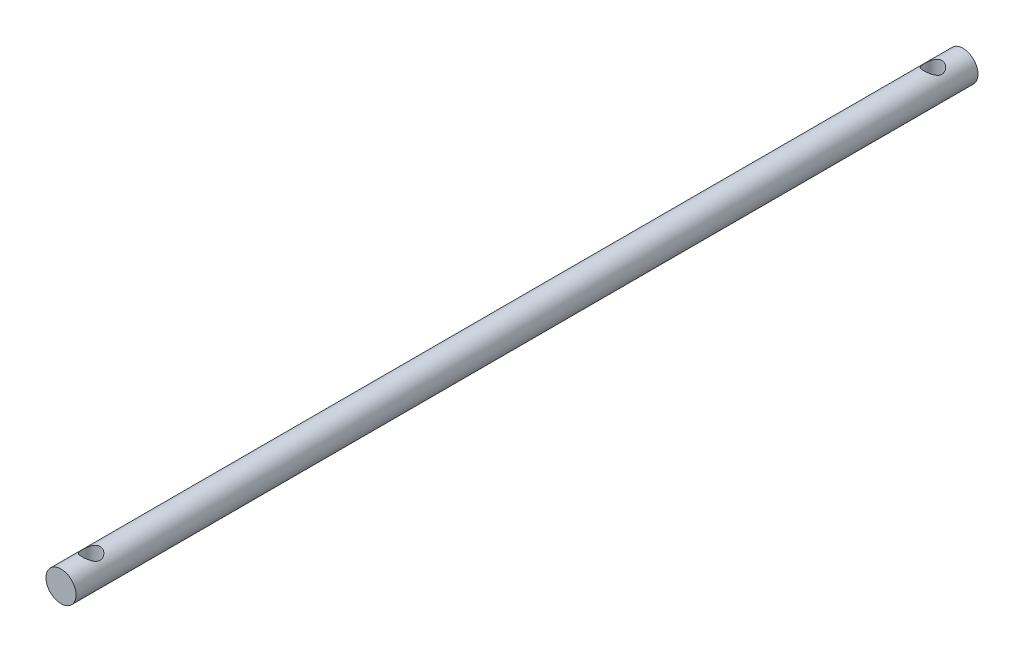
ISO-10303-21;
HEADER;
FILE_DESCRIPTION(('STEP AP214'),'2;1');
FILE_NAME('part.step','',(''),(''),'','','');
FILE_SCHEMA(('AUTOMOTIVE_DESIGN { 1 0 10303 214 1 1 1 1 }'));
ENDSEC;
DATA;
#1=APPLICATION_CONTEXT('core data for automotive mechanical design processes');
#2=APPLICATION_PROTOCOL_DEFINITION('international standard','automotive_design',2000,#1);
#3=PRODUCT_CONTEXT('',#1,'mechanical');
#4=PRODUCT('Part','Part','',(#3));
#5=PRODUCT_RELATED_PRODUCT_CATEGORY('part','',(#4));
#6=PRODUCT_DEFINITION_FORMATION('','',#4);
#7=PRODUCT_DEFINITION_CONTEXT('part definition',#1,'design');
#8=PRODUCT_DEFINITION('design','',#6,#7);
#9=PRODUCT_DEFINITION_SHAPE('','',#8);
#10=(LENGTH_UNIT() NAMED_UNIT(*) SI_UNIT(.MILLI.,.METRE.));
#11=(NAMED_UNIT(*) PLANE_ANGLE_UNIT() SI_UNIT($,.RADIAN.));
#12=(NAMED_UNIT(*) SI_UNIT($,.STERADIAN.) SOLID_ANGLE_UNIT());
#13=UNCERTAINTY_MEASURE_WITH_UNIT(LENGTH_MEASURE(1.E-05),#10,'distance_accuracy_value','');
#14=(GEOMETRIC_REPRESENTATION_CONTEXT(3) GLOBAL_UNCERTAINTY_ASSIGNED_CONTEXT((#13)) GLOBAL_UNIT_ASSIGNED_CONTEXT((#10,
#11,#12)) REPRESENTATION_CONTEXT('',''));
#15=CARTESIAN_POINT('',(0.,0.,0.));
#16=DIRECTION('',(0.,0.,1.));
#17=DIRECTION('',(1.,0.,0.));
#18=AXIS2_PLACEMENT_3D('',#15,#16,#17);
#19=CARTESIAN_POINT('',(0.,0.,150.));
#20=DIRECTION('',(0.,0.,-1.));
#21=DIRECTION('',(-1.,0.,0.));
#22=AXIS2_PLACEMENT_3D('',#19,#20,#21);
#23=CYLINDRICAL_SURFACE('',#22,2.5);
#24=CARTESIAN_POINT('',(0.,-2.5,146.5));
#25=CARTESIAN_POINT('',(0.0767298334620159,-2.49999625789732,146.49999590899));
#26=CARTESIAN_POINT('',(0.153582320644176,-2.4964290461501,146.494071329074));
#27=CARTESIAN_POINT('',(0.304975509530677,-2.48249903608568,146.470675680485));
#28=CARTESIAN_POINT('',(0.379510034596047,-2.47211948032719,146.453176138146));
#29=CARTESIAN_POINT('',(0.523751827790834,-2.44561558054488,146.407613638833));
#30=CARTESIAN_POINT('',(0.593481028226559,-2.42951973272944,146.379603041837));
#31=CARTESIAN_POINT('',(0.727030318214653,-2.39295367626408,146.314139666859));
#32=CARTESIAN_POINT('',(0.790851869416382,-2.37248455380255,146.276689233031));
#33=CARTESIAN_POINT('',(0.916299278999314,-2.32705360719088,146.190225173291));
#34=CARTESIAN_POINT('',(0.977384020081408,-2.30186792195985,146.140546304649));
#35=CARTESIAN_POINT('',(1.0908827041189,-2.25030439279634,146.032532796172));
#36=CARTESIAN_POINT('',(1.14328534948112,-2.22392505153571,145.974187062813));
#37=CARTESIAN_POINT('',(1.24444996762974,-2.1691106699591,145.842076489503));
#38=CARTESIAN_POINT('',(1.29197766378809,-2.14082017703649,145.767298229019));
#39=CARTESIAN_POINT('',(1.37361437764896,-2.08938301412124,145.609153426757));
#40=CARTESIAN_POINT('',(1.4077451733516,-2.06622802273938,145.525801103752));
#41=CARTESIAN_POINT('',(1.45440601714222,-2.0335462966093,145.373403549347));
#42=CARTESIAN_POINT('',(1.47016197246827,-2.02207883137591,145.30576400139));
#43=CARTESIAN_POINT('',(1.49216172340475,-2.00590308295502,145.16819628417));
#44=CARTESIAN_POINT('',(1.49841734556836,-2.00118639643759,145.098271071245));
#45=CARTESIAN_POINT('',(1.50105508796009,-1.99920922463856,144.957988505783));
#46=CARTESIAN_POINT('',(1.49741783408418,-2.00196337012718,144.887630574907));
#47=CARTESIAN_POINT('',(1.48046060478827,-2.01453261443742,144.748721224572));
#48=CARTESIAN_POINT('',(1.46713334620102,-2.02435302432227,144.680171204153));
#49=CARTESIAN_POINT('',(1.43173921881791,-2.04953186944259,144.547469757872));
#50=CARTESIAN_POINT('',(1.40978748666085,-2.06481711652538,144.483272946075));
#51=CARTESIAN_POINT('',(1.35795061770834,-2.0992705135083,144.359305009072));
#52=CARTESIAN_POINT('',(1.32806257259702,-2.11844008623467,144.299535516576));
#53=CARTESIAN_POINT('',(1.25517983184579,-2.16255327268987,144.175015902877));
#54=CARTESIAN_POINT('',(1.21080724397719,-2.18792043372994,144.111221907045));
#55=CARTESIAN_POINT('',(1.11291092783999,-2.23930599764383,143.991323516333));
#56=CARTESIAN_POINT('',(1.05937845100575,-2.26532500262151,143.935226566023));
#57=CARTESIAN_POINT('',(0.935811834382925,-2.31935504958318,143.824387018178));
#58=CARTESIAN_POINT('',(0.864517682704907,-2.34713836268534,143.770922693984));
#59=CARTESIAN_POINT('',(0.712276050458934,-2.39772428433983,143.676877952802));
#60=CARTESIAN_POINT('',(0.63133376394349,-2.42052955425517,143.63629064621));
#61=CARTESIAN_POINT('',(0.467197585268126,-2.45730392066153,143.572067817204));
#62=CARTESIAN_POINT('',(0.384467624173502,-2.47173957439705,143.547524644284));
#63=CARTESIAN_POINT('',(0.215047895144566,-2.49218842813551,143.512988802595));
#64=CARTESIAN_POINT('',(0.128363005661248,-2.49821172952738,143.502978682246));
#65=CARTESIAN_POINT('',(-0.0337146143774628,-2.5009057037461,143.498492152322));
#66=CARTESIAN_POINT('',(-0.109042473418783,-2.49873521714285,143.502091144915));
#67=CARTESIAN_POINT('',(-0.257829401986121,-2.48778712087048,143.520425853072));
#68=CARTESIAN_POINT('',(-0.331288509376163,-2.47900964518037,143.535161342806));
#69=CARTESIAN_POINT('',(-0.472574932157667,-2.4559479244219,143.574543432813));
#70=CARTESIAN_POINT('',(-0.540495750928538,-2.44180275662554,143.598940349074));
#71=CARTESIAN_POINT('',(-0.671265749087314,-2.40913880862843,143.656677376365));
#72=CARTESIAN_POINT('',(-0.734113924963957,-2.3906191658651,143.690019251347));
#73=CARTESIAN_POINT('',(-0.86000626282391,-2.34845496237359,143.768556979209));
#74=CARTESIAN_POINT('',(-0.922394150456884,-2.32447802739878,143.814623829078));
#75=CARTESIAN_POINT('',(-1.03902603131018,-2.2747426557473,143.915391393489));
#76=CARTESIAN_POINT('',(-1.09326040273742,-2.24898216586359,143.970102154853));
#77=CARTESIAN_POINT('',(-1.19931996735583,-2.19445423909889,144.094910390037));
#78=CARTESIAN_POINT('',(-1.24991019630918,-2.16573241746289,144.166083885466));
#79=CARTESIAN_POINT('',(-1.33845238915671,-2.11216182066708,144.317216024568));
#80=CARTESIAN_POINT('',(-1.37641766769784,-2.08730897997688,144.397165293893));
#81=CARTESIAN_POINT('',(-1.43142578795779,-2.04984909240518,144.546243022307));
#82=CARTESIAN_POINT('',(-1.45121625336192,-2.03575659328727,144.613980312359));
#83=CARTESIAN_POINT('',(-1.48113663905973,-2.01409605743543,144.75253207808));
#84=CARTESIAN_POINT('',(-1.49127995297632,-2.0065189764272,144.823342144328));
#85=CARTESIAN_POINT('',(-1.50134130416631,-1.99900446616267,144.966376947597));
#86=CARTESIAN_POINT('',(-1.50122089107869,-1.99909576445937,145.038605990687));
#87=CARTESIAN_POINT('',(-1.49066472959327,-2.00697717892851,145.18189443561));
#88=CARTESIAN_POINT('',(-1.48022337215758,-2.01477148138821,145.252953180081));
#89=CARTESIAN_POINT('',(-1.45040174148911,-2.03633185242981,145.388488417572));
#90=CARTESIAN_POINT('',(-1.43147636845349,-2.04979211805582,145.453117094307));
#91=CARTESIAN_POINT('',(-1.3856324207699,-2.08105501960154,145.578337254474));
#92=CARTESIAN_POINT('',(-1.35871083588476,-2.09885929040484,145.638927206961));
#93=CARTESIAN_POINT('',(-1.29289245555729,-2.14012990550919,145.764319857221));
#94=CARTESIAN_POINT('',(-1.25279167675749,-2.16404587582642,145.828341103854));
#95=CARTESIAN_POINT('',(-1.16375698389079,-2.21320127030771,145.949380072617));
#96=CARTESIAN_POINT('',(-1.11481579607793,-2.23844177205024,146.006391962153));
#97=CARTESIAN_POINT('',(-1.00009777425728,-2.29225690291479,146.121350949132));
#98=CARTESIAN_POINT('',(-0.932876819313839,-2.3207030866366,146.177931074896));
#99=CARTESIAN_POINT('',(-0.788462434445521,-2.3736542887237,146.279097855863));
#100=CARTESIAN_POINT('',(-0.711265444501472,-2.39815789310938,146.323680211985));
#101=CARTESIAN_POINT('',(-0.551125230801383,-2.43985578654396,146.397785807574));
#102=CARTESIAN_POINT('',(-0.468430086957142,-2.45725077479788,146.427728064927));
#103=CARTESIAN_POINT('',(-0.297973306118727,-2.48366273001247,146.472724695211));
#104=CARTESIAN_POINT('',(-0.210232099648524,-2.49271125871486,146.487835167857));
#105=CARTESIAN_POINT('',(-0.101558096917456,-2.49802001168187,146.496697454709));
#106=CARTESIAN_POINT('',(-0.0812762590282132,-2.49876114656362,146.497934417306));
#107=CARTESIAN_POINT('',(-0.0406658206870801,-2.49975164517367,146.499586246371));
#108=CARTESIAN_POINT('',(-0.0203372186375532,-2.50000099184316,146.500001084321));
#109=CARTESIAN_POINT('',(0.,-2.5,146.5));
#110=B_SPLINE_CURVE_WITH_KNOTS('',3,(#24,#25,#26,#27,#28,#29,#30,#31,#32,#33,#34,#35,#36,#37,
#38,#39,#40,#41,#42,#43,#44,#45,#46,#47,#48,#49,#50,#51,#52,#53,#54,#55,#56,#57,#58,#59,#60,#61,
#62,#63,#64,#65,#66,#67,#68,#69,#70,#71,#72,#73,#74,#75,#76,#77,#78,#79,#80,#81,#82,#83,#84,#85,
#86,#87,#88,#89,#90,#91,#92,#93,#94,#95,#96,#97,#98,#99,#100,#101,#102,#103,#104,#105,#106,#107,
#108,#109),.UNSPECIFIED.,.T.,.F.,(4,2,2,2,2,2,2,2,2,2,2,2,2,2,2,2,2,2,2,2,2,2,2,2,2,2,2,2,2,2,2,
2,2,2,2,2,2,2,2,2,2,2,4),(0.,0.230102237548649,0.460772627520007,0.690308884600004,
0.919788197992267,1.16681590732472,1.41416257934799,1.69183813189807,1.96906040692093,
2.17933829855636,2.38935420916583,2.59978170870732,2.81036753273875,3.01823267593212,
3.22617409809876,3.47046995225169,3.71500044803681,3.99360957884698,4.27206939275333,
4.53296790696568,4.79355286918243,5.01875602722433,5.24395461863461,5.46367785689779,
5.68344445659031,5.92601365818369,6.16886690081842,6.44336762428016,6.71757792616464,
6.932577873147,7.14727888733327,7.36278425777438,7.57840681155732,7.78364098331153,
7.9889525152304,8.22578610052296,8.46281544370218,8.73854311775526,9.01436946031993,
9.28175654462684,9.54812832184458,9.60911473335182,9.67010326027641),.UNSPECIFIED.);
#111=CARTESIAN_POINT('',(0.,-2.5,146.5));
#112=VERTEX_POINT('',#111);
#113=EDGE_CURVE('E35',#112,#112,#110,.T.);
#114=ORIENTED_EDGE('',*,*,#113,.T.);
#115=EDGE_LOOP('',(#114));
#116=FACE_BOUND('',#115,.T.);
#117=CARTESIAN_POINT('',(0.,2.5,146.5));
#118=CARTESIAN_POINT('',(-0.0767298334620159,2.49999625789732,146.49999590899));
#119=CARTESIAN_POINT('',(-0.153582320644176,2.4964290461501,146.494071329074));
#120=CARTESIAN_POINT('',(-0.304975509530677,2.48249903608568,146.470675680485));
#121=CARTESIAN_POINT('',(-0.379510034596047,2.47211948032719,146.453176138146));
#122=CARTESIAN_POINT('',(-0.523751827790834,2.44561558054488,146.407613638833));
#123=CARTESIAN_POINT('',(-0.593481028226559,2.42951973272944,146.379603041837));
#124=CARTESIAN_POINT('',(-0.727030318214653,2.39295367626408,146.314139666859));
#125=CARTESIAN_POINT('',(-0.790851869416382,2.37248455380255,146.276689233031));
#126=CARTESIAN_POINT('',(-0.916299278999314,2.32705360719088,146.190225173291));
#127=CARTESIAN_POINT('',(-0.977384020081408,2.30186792195985,146.140546304649));
#128=CARTESIAN_POINT('',(-1.0908827041189,2.25030439279634,146.032532796172));
#129=CARTESIAN_POINT('',(-1.14328534948112,2.22392505153571,145.974187062813));
#130=CARTESIAN_POINT('',(-1.24444996762974,2.1691106699591,145.842076489503));
#131=CARTESIAN_POINT('',(-1.29197766378809,2.14082017703649,145.767298229019));
#132=CARTESIAN_POINT('',(-1.37361437764896,2.08938301412124,145.609153426757));
#133=CARTESIAN_POINT('',(-1.4077451733516,2.06622802273938,145.525801103752));
#134=CARTESIAN_POINT('',(-1.45440601714222,2.0335462966093,145.373403549347));
#135=CARTESIAN_POINT('',(-1.47016197246827,2.02207883137591,145.30576400139));
#136=CARTESIAN_POINT('',(-1.49216172340475,2.00590308295502,145.16819628417));
#137=CARTESIAN_POINT('',(-1.49841734556836,2.00118639643759,145.098271071245));
#138=CARTESIAN_POINT('',(-1.50105508796009,1.99920922463856,144.957988505783));
#139=CARTESIAN_POINT('',(-1.49741783408418,2.00196337012718,144.887630574907));
#140=CARTESIAN_POINT('',(-1.48046060478827,2.01453261443742,144.748721224572));
#141=CARTESIAN_POINT('',(-1.46713334620102,2.02435302432227,144.680171204153));
#142=CARTESIAN_POINT('',(-1.43173921881791,2.04953186944259,144.547469757872));
#143=CARTESIAN_POINT('',(-1.40978748666085,2.06481711652538,144.483272946075));
#144=CARTESIAN_POINT('',(-1.35795061770834,2.0992705135083,144.359305009072));
#145=CARTESIAN_POINT('',(-1.32806257259702,2.11844008623467,144.299535516576));
#146=CARTESIAN_POINT('',(-1.25517983184579,2.16255327268987,144.175015902877));
#147=CARTESIAN_POINT('',(-1.21080724397719,2.18792043372994,144.111221907045));
#148=CARTESIAN_POINT('',(-1.11291092783999,2.23930599764383,143.991323516333));
#149=CARTESIAN_POINT('',(-1.05937845100575,2.26532500262151,143.935226566023));
#150=CARTESIAN_POINT('',(-0.935811834382925,2.31935504958318,143.824387018178));
#151=CARTESIAN_POINT('',(-0.864517682704907,2.34713836268534,143.770922693984));
#152=CARTESIAN_POINT('',(-0.712276050458934,2.39772428433983,143.676877952802));
#153=CARTESIAN_POINT('',(-0.63133376394349,2.42052955425517,143.63629064621));
#154=CARTESIAN_POINT('',(-0.467197585268126,2.45730392066153,143.572067817204));
#155=CARTESIAN_POINT('',(-0.384467624173502,2.47173957439705,143.547524644284));
#156=CARTESIAN_POINT('',(-0.215047895144566,2.49218842813551,143.512988802595));
#157=CARTESIAN_POINT('',(-0.128363005661248,2.49821172952738,143.502978682246));
#158=CARTESIAN_POINT('',(0.0337146143774628,2.5009057037461,143.498492152322));
#159=CARTESIAN_POINT('',(0.109042473418783,2.49873521714285,143.502091144915));
#160=CARTESIAN_POINT('',(0.257829401986121,2.48778712087048,143.520425853072));
#161=CARTESIAN_POINT('',(0.331288509376163,2.47900964518037,143.535161342806));
#162=CARTESIAN_POINT('',(0.472574932157667,2.4559479244219,143.574543432813));
#163=CARTESIAN_POINT('',(0.540495750928538,2.44180275662554,143.598940349074));
#164=CARTESIAN_POINT('',(0.671265749087314,2.40913880862843,143.656677376365));
#165=CARTESIAN_POINT('',(0.734113924963957,2.3906191658651,143.690019251347));
#166=CARTESIAN_POINT('',(0.86000626282391,2.34845496237359,143.768556979209));
#167=CARTESIAN_POINT('',(0.922394150456884,2.32447802739878,143.814623829078));
#168=CARTESIAN_POINT('',(1.03902603131018,2.2747426557473,143.915391393489));
#169=CARTESIAN_POINT('',(1.09326040273742,2.24898216586359,143.970102154853));
#170=CARTESIAN_POINT('',(1.19931996735583,2.19445423909889,144.094910390037));
#171=CARTESIAN_POINT('',(1.24991019630918,2.16573241746289,144.166083885466));
#172=CARTESIAN_POINT('',(1.33845238915671,2.11216182066708,144.317216024568));
#173=CARTESIAN_POINT('',(1.37641766769784,2.08730897997688,144.397165293893));
#174=CARTESIAN_POINT('',(1.43142578795779,2.04984909240518,144.546243022307));
#175=CARTESIAN_POINT('',(1.45121625336192,2.03575659328727,144.613980312359));
#176=CARTESIAN_POINT('',(1.48113663905973,2.01409605743543,144.75253207808));
#177=CARTESIAN_POINT('',(1.49127995297632,2.0065189764272,144.823342144328));
#178=CARTESIAN_POINT('',(1.50134130416631,1.99900446616267,144.966376947597));
#179=CARTESIAN_POINT('',(1.50122089107869,1.99909576445937,145.038605990687));
#180=CARTESIAN_POINT('',(1.49066472959327,2.00697717892851,145.18189443561));
#181=CARTESIAN_POINT('',(1.48022337215758,2.01477148138821,145.252953180081));
#182=CARTESIAN_POINT('',(1.45040174148911,2.03633185242981,145.388488417572));
#183=CARTESIAN_POINT('',(1.43147636845349,2.04979211805582,145.453117094307));
#184=CARTESIAN_POINT('',(1.3856324207699,2.08105501960154,145.578337254474));
#185=CARTESIAN_POINT('',(1.35871083588476,2.09885929040484,145.638927206961));
#186=CARTESIAN_POINT('',(1.29289245555729,2.14012990550919,145.764319857221));
#187=CARTESIAN_POINT('',(1.25279167675749,2.16404587582642,145.828341103854));
#188=CARTESIAN_POINT('',(1.16375698389079,2.21320127030771,145.949380072617));
#189=CARTESIAN_POINT('',(1.11481579607793,2.23844177205024,146.006391962153));
#190=CARTESIAN_POINT('',(1.00009777425728,2.29225690291479,146.121350949132));
#191=CARTESIAN_POINT('',(0.932876819313839,2.3207030866366,146.177931074896));
#192=CARTESIAN_POINT('',(0.788462434445521,2.3736542887237,146.279097855863));
#193=CARTESIAN_POINT('',(0.711265444501472,2.39815789310938,146.323680211985));
#194=CARTESIAN_POINT('',(0.551125230801383,2.43985578654396,146.397785807574));
#195=CARTESIAN_POINT('',(0.468430086957142,2.45725077479788,146.427728064927));
#196=CARTESIAN_POINT('',(0.297973306118727,2.48366273001247,146.472724695211));
#197=CARTESIAN_POINT('',(0.210232099648524,2.49271125871486,146.487835167857));
#198=CARTESIAN_POINT('',(0.101558096917456,2.49802001168187,146.496697454709));
#199=CARTESIAN_POINT('',(0.0812762590282132,2.49876114656362,146.497934417306));
#200=CARTESIAN_POINT('',(0.0406658206870801,2.49975164517367,146.499586246371));
#201=CARTESIAN_POINT('',(0.0203372186375532,2.50000099184316,146.500001084321));
#202=CARTESIAN_POINT('',(0.,2.5,146.5));
#203=B_SPLINE_CURVE_WITH_KNOTS('',3,(#117,#118,#119,#120,#121,#122,#123,#124,#125,#126,#127,
#128,#129,#130,#131,#132,#133,#134,#135,#136,#137,#138,#139,#140,#141,#142,#143,#144,#145,#146,
#147,#148,#149,#150,#151,#152,#153,#154,#155,#156,#157,#158,#159,#160,#161,#162,#163,#164,#165,
#166,#167,#168,#169,#170,#171,#172,#173,#174,#175,#176,#177,#178,#179,#180,#181,#182,#183,#184,
#185,#186,#187,#188,#189,#190,#191,#192,#193,#194,#195,#196,#197,#198,#199,#200,#201,#202),
.UNSPECIFIED.,.T.,.F.,(4,2,2,2,2,2,2,2,2,2,2,2,2,2,2,2,2,2,2,2,2,2,2,2,2,2,2,2,2,2,2,2,2,2,2,2,
2,2,2,2,2,2,4),(0.,0.230102237548649,0.460772627520007,0.690308884600004,0.919788197992267,
1.16681590732472,1.41416257934799,1.69183813189807,1.96906040692093,2.17933829855636,
2.38935420916583,2.59978170870732,2.81036753273875,3.01823267593212,3.22617409809876,
3.47046995225169,3.71500044803681,3.99360957884698,4.27206939275333,4.53296790696568,
4.79355286918243,5.01875602722433,5.24395461863461,5.46367785689779,5.68344445659031,
5.92601365818369,6.16886690081842,6.44336762428016,6.71757792616464,6.932577873147,
7.14727888733327,7.36278425777438,7.57840681155732,7.78364098331153,7.9889525152304,
8.22578610052296,8.46281544370218,8.73854311775526,9.01436946031993,9.28175654462684,
9.54812832184458,9.60911473335182,9.67010326027641),.UNSPECIFIED.);
#204=CARTESIAN_POINT('',(0.,2.5,146.5));
#205=VERTEX_POINT('',#204);
#206=EDGE_CURVE('E84',#205,#205,#203,.T.);
#207=ORIENTED_EDGE('',*,*,#206,.T.);
#208=EDGE_LOOP('',(#207));
#209=FACE_BOUND('',#208,.T.);
#210=CARTESIAN_POINT('',(0.,-2.5,6.5));
#211=CARTESIAN_POINT('',(0.0767298334620158,-2.49999625789732,6.49999590899012));
#212=CARTESIAN_POINT('',(0.153582320644178,-2.4964290461501,6.49407132907374));
#213=CARTESIAN_POINT('',(0.304975509530679,-2.48249903608568,6.47067568048467));
#214=CARTESIAN_POINT('',(0.379510034596047,-2.47211948032719,6.45317613814578));
#215=CARTESIAN_POINT('',(0.523751827790837,-2.44561558054488,6.40761363883314));
#216=CARTESIAN_POINT('',(0.593481028226566,-2.42951973272944,6.37960304183684));
#217=CARTESIAN_POINT('',(0.727030318214659,-2.39295367626407,6.31413966685897));
#218=CARTESIAN_POINT('',(0.790851869416383,-2.37248455380255,6.27668923303125));
#219=CARTESIAN_POINT('',(0.916299278999315,-2.32705360719088,6.19022517329142));
#220=CARTESIAN_POINT('',(0.977384020081415,-2.30186792195985,6.14054630464861));
#221=CARTESIAN_POINT('',(1.09088270411891,-2.25030439279634,6.03253279617173));
#222=CARTESIAN_POINT('',(1.14328534948112,-2.22392505153571,5.97418706281268));
#223=CARTESIAN_POINT('',(1.24444996762974,-2.1691106699591,5.84207648950327));
#224=CARTESIAN_POINT('',(1.29197766378809,-2.14082017703649,5.76729822901871));
#225=CARTESIAN_POINT('',(1.37361437764896,-2.08938301412124,5.60915342675689));
#226=CARTESIAN_POINT('',(1.4077451733516,-2.06622802273938,5.52580110375243));
#227=CARTESIAN_POINT('',(1.45440601714222,-2.0335462966093,5.37340354934676));
#228=CARTESIAN_POINT('',(1.47016197246826,-2.02207883137591,5.30576400138968));
#229=CARTESIAN_POINT('',(1.49216172340475,-2.00590308295503,5.16819628416964));
#230=CARTESIAN_POINT('',(1.49841734556836,-2.00118639643759,5.09827107124551));
#231=CARTESIAN_POINT('',(1.50105508796009,-1.99920922463856,4.95798850578266));
#232=CARTESIAN_POINT('',(1.49741783408419,-2.00196337012718,4.8876305749068));
#233=CARTESIAN_POINT('',(1.48046060478828,-2.01453261443741,4.74872122457241));
#234=CARTESIAN_POINT('',(1.46713334620103,-2.02435302432226,4.68017120415255));
#235=CARTESIAN_POINT('',(1.43173921881792,-2.04953186944258,4.54746975787189));
#236=CARTESIAN_POINT('',(1.40978748666087,-2.06481711652537,4.48327294607552));
#237=CARTESIAN_POINT('',(1.35795061770837,-2.09927051350828,4.35930500907188));
#238=CARTESIAN_POINT('',(1.32806257259705,-2.11844008623465,4.29953551657607));
#239=CARTESIAN_POINT('',(1.25517983184583,-2.16255327268985,4.1750159028772));
#240=CARTESIAN_POINT('',(1.21080724397723,-2.18792043372992,4.11122190704507));
#241=CARTESIAN_POINT('',(1.11291092784003,-2.23930599764381,3.99132351633298));
#242=CARTESIAN_POINT('',(1.05937845100579,-2.26532500262149,3.93522656602349));
#243=CARTESIAN_POINT('',(0.935811834382965,-2.31935504958317,3.82438701817824));
#244=CARTESIAN_POINT('',(0.864517682704956,-2.34713836268532,3.77092269398401));
#245=CARTESIAN_POINT('',(0.712276050458999,-2.39772428433981,3.67687795280209));
#246=CARTESIAN_POINT('',(0.631333763943563,-2.42052955425515,3.63629064621005));
#247=CARTESIAN_POINT('',(0.467197585268205,-2.45730392066151,3.5720678172041));
#248=CARTESIAN_POINT('',(0.384467624173579,-2.47173957439704,3.54752464428409));
#249=CARTESIAN_POINT('',(0.215047895144639,-2.49218842813551,3.51298880259462));
#250=CARTESIAN_POINT('',(0.128363005661318,-2.49821172952738,3.50297868224643));
#251=CARTESIAN_POINT('',(-0.0337146143773972,-2.5009057037461,3.49849215232169));
#252=CARTESIAN_POINT('',(-0.109042473418719,-2.49873521714286,3.50209114491483));
#253=CARTESIAN_POINT('',(-0.257829401986061,-2.48778712087049,3.52042585307192));
#254=CARTESIAN_POINT('',(-0.331288509376106,-2.47900964518037,3.53516134280581));
#255=CARTESIAN_POINT('',(-0.472574932157613,-2.4559479244219,3.57454343281246));
#256=CARTESIAN_POINT('',(-0.540495750928484,-2.44180275662555,3.59894034907347));
#257=CARTESIAN_POINT('',(-0.671265749087263,-2.40913880862845,3.65667737636527));
#258=CARTESIAN_POINT('',(-0.734113924963909,-2.39061916586511,3.69001925134667));
#259=CARTESIAN_POINT('',(-0.860006262823864,-2.3484549623736,3.76855697920871));
#260=CARTESIAN_POINT('',(-0.922394150456837,-2.3244780273988,3.81462382907839));
#261=CARTESIAN_POINT('',(-1.03902603131014,-2.27474265574732,3.91539139348862));
#262=CARTESIAN_POINT('',(-1.09326040273738,-2.2489821658636,3.97010215485254));
#263=CARTESIAN_POINT('',(-1.19931996735579,-2.19445423909891,4.09491039003715));
#264=CARTESIAN_POINT('',(-1.24991019630915,-2.16573241746291,4.1660838854655));
#265=CARTESIAN_POINT('',(-1.33845238915668,-2.1121618206671,4.3172160245682));
#266=CARTESIAN_POINT('',(-1.37641766769781,-2.0873089799769,4.39716529389279));
#267=CARTESIAN_POINT('',(-1.43142578795776,-2.04984909240519,4.54624302230669));
#268=CARTESIAN_POINT('',(-1.4512162533619,-2.03575659328729,4.61398031235859));
#269=CARTESIAN_POINT('',(-1.48113663905972,-2.01409605743544,4.7525320780801));
#270=CARTESIAN_POINT('',(-1.49127995297631,-2.00651897642721,4.82334214432783));
#271=CARTESIAN_POINT('',(-1.50134130416631,-1.99900446616268,4.96637694759703));
#272=CARTESIAN_POINT('',(-1.50122089107869,-1.99909576445937,5.03860599068704));
#273=CARTESIAN_POINT('',(-1.49066472959328,-2.0069771789285,5.18189443560946));
#274=CARTESIAN_POINT('',(-1.48022337215759,-2.0147714813882,5.2529531800806));
#275=CARTESIAN_POINT('',(-1.45040174148913,-2.0363318524298,5.38848841757219));
#276=CARTESIAN_POINT('',(-1.43147636845351,-2.04979211805581,5.45311709430687));
#277=CARTESIAN_POINT('',(-1.38563242076993,-2.08105501960152,5.57833725447422));
#278=CARTESIAN_POINT('',(-1.35871083588479,-2.09885929040482,5.63892720696055));
#279=CARTESIAN_POINT('',(-1.29289245555732,-2.14012990550917,5.76431985722078));
#280=CARTESIAN_POINT('',(-1.25279167675753,-2.16404587582639,5.82834110385431));
#281=CARTESIAN_POINT('',(-1.16375698389085,-2.21320127030768,5.94938007261729));
#282=CARTESIAN_POINT('',(-1.11481579607798,-2.23844177205021,6.00639196215256));
#283=CARTESIAN_POINT('',(-1.00009777425734,-2.29225690291476,6.12135094913167));
#284=CARTESIAN_POINT('',(-0.932876819313905,-2.32070308663658,6.17793107489619));
#285=CARTESIAN_POINT('',(-0.78846243444559,-2.37365428872367,6.27909785586331));
#286=CARTESIAN_POINT('',(-0.71126544450154,-2.39815789310936,6.32368021198479));
#287=CARTESIAN_POINT('',(-0.551125230801454,-2.43985578654394,6.39778580757374));
#288=CARTESIAN_POINT('',(-0.468430086957214,-2.45725077479787,6.42772806492683));
#289=CARTESIAN_POINT('',(-0.297973306118808,-2.48366273001246,6.47272469521098));
#290=CARTESIAN_POINT('',(-0.210232099648613,-2.49271125871485,6.48783516785699));
#291=CARTESIAN_POINT('',(-0.101558096917536,-2.49802001168187,6.49669745470866));
#292=CARTESIAN_POINT('',(-0.0812762590282776,-2.49876114656362,6.4979344173061));
#293=CARTESIAN_POINT('',(-0.0406658206871124,-2.49975164517367,6.49958624637086));
#294=CARTESIAN_POINT('',(-0.0203372186375695,-2.50000099184316,6.5000010843209));
#295=CARTESIAN_POINT('',(0.,-2.5,6.5));
#296=B_SPLINE_CURVE_WITH_KNOTS('',3,(#210,#211,#212,#213,#214,#215,#216,#217,#218,#219,#220,
#221,#222,#223,#224,#225,#226,#227,#228,#229,#230,#231,#232,#233,#234,#235,#236,#237,#238,#239,
#240,#241,#242,#243,#244,#245,#246,#247,#248,#249,#250,#251,#252,#253,#254,#255,#256,#257,#258,
#259,#260,#261,#262,#263,#264,#265,#266,#267,#268,#269,#270,#271,#272,#273,#274,#275,#276,#277,
#278,#279,#280,#281,#282,#283,#284,#285,#286,#287,#288,#289,#290,#291,#292,#293,#294,#295),
.UNSPECIFIED.,.T.,.F.,(4,2,2,2,2,2,2,2,2,2,2,2,2,2,2,2,2,2,2,2,2,2,2,2,2,2,2,2,2,2,2,2,2,2,2,2,
2,2,2,2,2,2,4),(0.,0.230102237548649,0.460772627520012,0.690308884600012,0.919788197992275,
1.16681590732473,1.41416257934801,1.69183813189807,1.96906040692092,2.17933829855633,
2.38935420916578,2.59978170870726,2.81036753273872,3.01823267593207,3.22617409809868,
3.47046995225163,3.71500044803674,3.99360957884691,4.27206939275324,4.5329679069656,
4.79355286918236,5.01875602722426,5.24395461863455,5.46367785689772,5.68344445659025,
5.92601365818362,6.16886690081836,6.44336762428009,6.71757792616456,6.93257787314692,
7.14727888733318,7.36278425777433,7.57840681155725,7.78364098331141,7.98895251523035,
8.22578610052286,8.46281544370207,8.73854311775518,9.01436946031985,9.28175654462676,
9.54812832184448,9.60911473335177,9.6701032602764),.UNSPECIFIED.);
#297=CARTESIAN_POINT('',(0.,-2.5,6.5));
#298=VERTEX_POINT('',#297);
#299=EDGE_CURVE('E47',#298,#298,#296,.T.);
#300=ORIENTED_EDGE('',*,*,#299,.T.);
#301=EDGE_LOOP('',(#300));
#302=FACE_BOUND('',#301,.T.);
#303=CARTESIAN_POINT('',(0.,2.5,6.5));
#304=CARTESIAN_POINT('',(-0.0767298334620158,2.49999625789732,6.49999590899012));
#305=CARTESIAN_POINT('',(-0.153582320644178,2.4964290461501,6.49407132907374));
#306=CARTESIAN_POINT('',(-0.304975509530679,2.48249903608568,6.47067568048467));
#307=CARTESIAN_POINT('',(-0.379510034596047,2.47211948032719,6.45317613814578));
#308=CARTESIAN_POINT('',(-0.523751827790837,2.44561558054488,6.40761363883314));
#309=CARTESIAN_POINT('',(-0.593481028226566,2.42951973272944,6.37960304183684));
#310=CARTESIAN_POINT('',(-0.727030318214659,2.39295367626407,6.31413966685897));
#311=CARTESIAN_POINT('',(-0.790851869416383,2.37248455380255,6.27668923303125));
#312=CARTESIAN_POINT('',(-0.916299278999315,2.32705360719088,6.19022517329142));
#313=CARTESIAN_POINT('',(-0.977384020081415,2.30186792195985,6.14054630464861));
#314=CARTESIAN_POINT('',(-1.09088270411891,2.25030439279634,6.03253279617173));
#315=CARTESIAN_POINT('',(-1.14328534948112,2.22392505153571,5.97418706281268));
#316=CARTESIAN_POINT('',(-1.24444996762974,2.1691106699591,5.84207648950327));
#317=CARTESIAN_POINT('',(-1.29197766378809,2.14082017703649,5.76729822901871));
#318=CARTESIAN_POINT('',(-1.37361437764896,2.08938301412124,5.60915342675689));
#319=CARTESIAN_POINT('',(-1.4077451733516,2.06622802273938,5.52580110375243));
#320=CARTESIAN_POINT('',(-1.45440601714222,2.0335462966093,5.37340354934676));
#321=CARTESIAN_POINT('',(-1.47016197246826,2.02207883137591,5.30576400138968));
#322=CARTESIAN_POINT('',(-1.49216172340475,2.00590308295503,5.16819628416964));
#323=CARTESIAN_POINT('',(-1.49841734556836,2.00118639643759,5.09827107124551));
#324=CARTESIAN_POINT('',(-1.50105508796009,1.99920922463856,4.95798850578266));
#325=CARTESIAN_POINT('',(-1.49741783408419,2.00196337012718,4.8876305749068));
#326=CARTESIAN_POINT('',(-1.48046060478828,2.01453261443741,4.74872122457241));
#327=CARTESIAN_POINT('',(-1.46713334620103,2.02435302432226,4.68017120415255));
#328=CARTESIAN_POINT('',(-1.43173921881792,2.04953186944258,4.54746975787189));
#329=CARTESIAN_POINT('',(-1.40978748666087,2.06481711652537,4.48327294607552));
#330=CARTESIAN_POINT('',(-1.35795061770837,2.09927051350828,4.35930500907188));
#331=CARTESIAN_POINT('',(-1.32806257259705,2.11844008623465,4.29953551657607));
#332=CARTESIAN_POINT('',(-1.25517983184583,2.16255327268985,4.1750159028772));
#333=CARTESIAN_POINT('',(-1.21080724397723,2.18792043372992,4.11122190704507));
#334=CARTESIAN_POINT('',(-1.11291092784003,2.23930599764381,3.99132351633298));
#335=CARTESIAN_POINT('',(-1.05937845100579,2.26532500262149,3.93522656602349));
#336=CARTESIAN_POINT('',(-0.935811834382965,2.31935504958317,3.82438701817824));
#337=CARTESIAN_POINT('',(-0.864517682704956,2.34713836268532,3.77092269398401));
#338=CARTESIAN_POINT('',(-0.712276050458999,2.39772428433981,3.67687795280209));
#339=CARTESIAN_POINT('',(-0.631333763943563,2.42052955425515,3.63629064621005));
#340=CARTESIAN_POINT('',(-0.467197585268205,2.45730392066151,3.5720678172041));
#341=CARTESIAN_POINT('',(-0.384467624173579,2.47173957439704,3.54752464428409));
#342=CARTESIAN_POINT('',(-0.215047895144639,2.49218842813551,3.51298880259462));
#343=CARTESIAN_POINT('',(-0.128363005661318,2.49821172952738,3.50297868224643));
#344=CARTESIAN_POINT('',(0.0337146143773972,2.5009057037461,3.49849215232169));
#345=CARTESIAN_POINT('',(0.109042473418719,2.49873521714286,3.50209114491483));
#346=CARTESIAN_POINT('',(0.257829401986061,2.48778712087049,3.52042585307192));
#347=CARTESIAN_POINT('',(0.331288509376106,2.47900964518037,3.53516134280581));
#348=CARTESIAN_POINT('',(0.472574932157613,2.4559479244219,3.57454343281246));
#349=CARTESIAN_POINT('',(0.540495750928484,2.44180275662555,3.59894034907347));
#350=CARTESIAN_POINT('',(0.671265749087263,2.40913880862845,3.65667737636527));
#351=CARTESIAN_POINT('',(0.734113924963909,2.39061916586511,3.69001925134667));
#352=CARTESIAN_POINT('',(0.860006262823864,2.3484549623736,3.76855697920871));
#353=CARTESIAN_POINT('',(0.922394150456837,2.3244780273988,3.81462382907839));
#354=CARTESIAN_POINT('',(1.03902603131014,2.27474265574732,3.91539139348862));
#355=CARTESIAN_POINT('',(1.09326040273738,2.2489821658636,3.97010215485254));
#356=CARTESIAN_POINT('',(1.19931996735579,2.19445423909891,4.09491039003715));
#357=CARTESIAN_POINT('',(1.24991019630915,2.16573241746291,4.1660838854655));
#358=CARTESIAN_POINT('',(1.33845238915668,2.1121618206671,4.3172160245682));
#359=CARTESIAN_POINT('',(1.37641766769781,2.0873089799769,4.39716529389279));
#360=CARTESIAN_POINT('',(1.43142578795776,2.04984909240519,4.54624302230669));
#361=CARTESIAN_POINT('',(1.4512162533619,2.03575659328729,4.61398031235859));
#362=CARTESIAN_POINT('',(1.48113663905972,2.01409605743544,4.7525320780801));
#363=CARTESIAN_POINT('',(1.49127995297631,2.00651897642721,4.82334214432783));
#364=CARTESIAN_POINT('',(1.50134130416631,1.99900446616268,4.96637694759703));
#365=CARTESIAN_POINT('',(1.50122089107869,1.99909576445937,5.03860599068704));
#366=CARTESIAN_POINT('',(1.49066472959328,2.0069771789285,5.18189443560946));
#367=CARTESIAN_POINT('',(1.48022337215759,2.0147714813882,5.2529531800806));
#368=CARTESIAN_POINT('',(1.45040174148913,2.0363318524298,5.38848841757219));
#369=CARTESIAN_POINT('',(1.43147636845351,2.04979211805581,5.45311709430687));
#370=CARTESIAN_POINT('',(1.38563242076993,2.08105501960152,5.57833725447422));
#371=CARTESIAN_POINT('',(1.35871083588479,2.09885929040482,5.63892720696055));
#372=CARTESIAN_POINT('',(1.29289245555732,2.14012990550917,5.76431985722078));
#373=CARTESIAN_POINT('',(1.25279167675753,2.16404587582639,5.82834110385431));
#374=CARTESIAN_POINT('',(1.16375698389085,2.21320127030768,5.94938007261729));
#375=CARTESIAN_POINT('',(1.11481579607798,2.23844177205021,6.00639196215256));
#376=CARTESIAN_POINT('',(1.00009777425734,2.29225690291476,6.12135094913167));
#377=CARTESIAN_POINT('',(0.932876819313905,2.32070308663658,6.17793107489619));
#378=CARTESIAN_POINT('',(0.78846243444559,2.37365428872367,6.27909785586331));
#379=CARTESIAN_POINT('',(0.71126544450154,2.39815789310936,6.32368021198479));
#380=CARTESIAN_POINT('',(0.551125230801454,2.43985578654394,6.39778580757374));
#381=CARTESIAN_POINT('',(0.468430086957214,2.45725077479787,6.42772806492683));
#382=CARTESIAN_POINT('',(0.297973306118808,2.48366273001246,6.47272469521098));
#383=CARTESIAN_POINT('',(0.210232099648613,2.49271125871485,6.48783516785699));
#384=CARTESIAN_POINT('',(0.101558096917536,2.49802001168187,6.49669745470866));
#385=CARTESIAN_POINT('',(0.0812762590282776,2.49876114656362,6.4979344173061));
#386=CARTESIAN_POINT('',(0.0406658206871124,2.49975164517367,6.49958624637086));
#387=CARTESIAN_POINT('',(0.0203372186375695,2.50000099184316,6.5000010843209));
#388=CARTESIAN_POINT('',(0.,2.5,6.5));
#389=B_SPLINE_CURVE_WITH_KNOTS('',3,(#303,#304,#305,#306,#307,#308,#309,#310,#311,#312,#313,
#314,#315,#316,#317,#318,#319,#320,#321,#322,#323,#324,#325,#326,#327,#328,#329,#330,#331,#332,
#333,#334,#335,#336,#337,#338,#339,#340,#341,#342,#343,#344,#345,#346,#347,#348,#349,#350,#351,
#352,#353,#354,#355,#356,#357,#358,#359,#360,#361,#362,#363,#364,#365,#366,#367,#368,#369,#370,
#371,#372,#373,#374,#375,#376,#377,#378,#379,#380,#381,#382,#383,#384,#385,#386,#387,#388),
.UNSPECIFIED.,.T.,.F.,(4,2,2,2,2,2,2,2,2,2,2,2,2,2,2,2,2,2,2,2,2,2,2,2,2,2,2,2,2,2,2,2,2,2,2,2,
2,2,2,2,2,2,4),(0.,0.230102237548649,0.460772627520012,0.690308884600012,0.919788197992275,
1.16681590732473,1.41416257934801,1.69183813189807,1.96906040692092,2.17933829855633,
2.38935420916578,2.59978170870726,2.81036753273872,3.01823267593207,3.22617409809868,
3.47046995225163,3.71500044803674,3.99360957884691,4.27206939275324,4.5329679069656,
4.79355286918236,5.01875602722426,5.24395461863455,5.46367785689772,5.68344445659025,
5.92601365818362,6.16886690081836,6.44336762428009,6.71757792616456,6.93257787314692,
7.14727888733318,7.36278425777433,7.57840681155725,7.78364098331141,7.98895251523035,
8.22578610052286,8.46281544370207,8.73854311775518,9.01436946031985,9.28175654462676,
9.54812832184448,9.60911473335177,9.6701032602764),.UNSPECIFIED.);
#390=CARTESIAN_POINT('',(0.,2.5,6.5));
#391=VERTEX_POINT('',#390);
#392=EDGE_CURVE('E50',#391,#391,#389,.T.);
#393=ORIENTED_EDGE('',*,*,#392,.T.);
#394=EDGE_LOOP('',(#393));
#395=FACE_BOUND('',#394,.T.);
#396=CARTESIAN_POINT('',(0.,0.,150.));
#397=DIRECTION('',(0.,0.,1.));
#398=DIRECTION('',(1.,0.,0.));
#399=AXIS2_PLACEMENT_3D('',#396,#397,#398);
#400=CIRCLE('',#399,2.5);
#401=CARTESIAN_POINT('',(2.5,0.,150.));
#402=VERTEX_POINT('',#401);
#403=EDGE_CURVE('E10',#402,#402,#400,.T.);
#404=ORIENTED_EDGE('',*,*,#403,.F.);
#405=EDGE_LOOP('',(#404));
#406=FACE_BOUND('',#405,.T.);
#407=CARTESIAN_POINT('',(0.,0.,0.));
#408=DIRECTION('',(0.,0.,1.));
#409=DIRECTION('',(1.,0.,0.));
#410=AXIS2_PLACEMENT_3D('',#407,#408,#409);
#411=CIRCLE('',#410,2.5);
#412=CARTESIAN_POINT('',(2.5,0.,0.));
#413=VERTEX_POINT('',#412);
#414=EDGE_CURVE('E42',#413,#413,#411,.T.);
#415=ORIENTED_EDGE('',*,*,#414,.T.);
#416=EDGE_LOOP('',(#415));
#417=FACE_BOUND('',#416,.T.);
#418=ADVANCED_FACE('F31',(#116,#209,#302,#395,#406,#417),#23,.T.);
#419=CARTESIAN_POINT('',(0.,0.,150.));
#420=DIRECTION('',(0.,0.,1.));
#421=DIRECTION('',(1.,0.,0.));
#422=AXIS2_PLACEMENT_3D('',#419,#420,#421);
#423=PLANE('',#422);
#424=ORIENTED_EDGE('',*,*,#403,.T.);
#425=EDGE_LOOP('',(#424));
#426=FACE_BOUND('',#425,.T.);
#427=ADVANCED_FACE('F66',(#426),#423,.T.);
#428=CARTESIAN_POINT('',(0.,0.,0.));
#429=DIRECTION('',(0.,0.,1.));
#430=DIRECTION('',(1.,0.,0.));
#431=AXIS2_PLACEMENT_3D('',#428,#429,#430);
#432=PLANE('',#431);
#433=ORIENTED_EDGE('',*,*,#414,.F.);
#434=EDGE_LOOP('',(#433));
#435=FACE_BOUND('',#434,.T.);
#436=ADVANCED_FACE('F63',(#435),#432,.F.);
#437=CARTESIAN_POINT('',(0.,-15.,5.));
#438=DIRECTION('',(0.,1.,0.));
#439=DIRECTION('',(0.,0.,1.));
#440=AXIS2_PLACEMENT_3D('',#437,#438,#439);
#441=CYLINDRICAL_SURFACE('',#440,1.5);
#442=ORIENTED_EDGE('',*,*,#392,.F.);
#443=EDGE_LOOP('',(#442));
#444=FACE_BOUND('',#443,.T.);
#445=ORIENTED_EDGE('',*,*,#299,.F.);
#446=EDGE_LOOP('',(#445));
#447=FACE_BOUND('',#446,.T.);
#448=ADVANCED_FACE('F58',(#444,#447),#441,.F.);
#449=CARTESIAN_POINT('',(0.,-15.,145.));
#450=DIRECTION('',(0.,1.,0.));
#451=DIRECTION('',(0.,0.,1.));
#452=AXIS2_PLACEMENT_3D('',#449,#450,#451);
#453=CYLINDRICAL_SURFACE('',#452,1.5);
#454=ORIENTED_EDGE('',*,*,#206,.F.);
#455=EDGE_LOOP('',(#454));
#456=FACE_BOUND('',#455,.T.);
#457=ORIENTED_EDGE('',*,*,#113,.F.);
#458=EDGE_LOOP('',(#457));
#459=FACE_BOUND('',#458,.T.);
#460=ADVANCED_FACE('F62',(#456,#459),#453,.F.);
#461=CLOSED_SHELL('',(#418,#427,#436,#448,#460));
#462=MANIFOLD_SOLID_BREP('B2',#461);
#463=ADVANCED_BREP_SHAPE_REPRESENTATION('',(#18,#462),#14);
#464=SHAPE_DEFINITION_REPRESENTATION(#9,#463);
ENDSEC;
END-ISO-10303-21;
